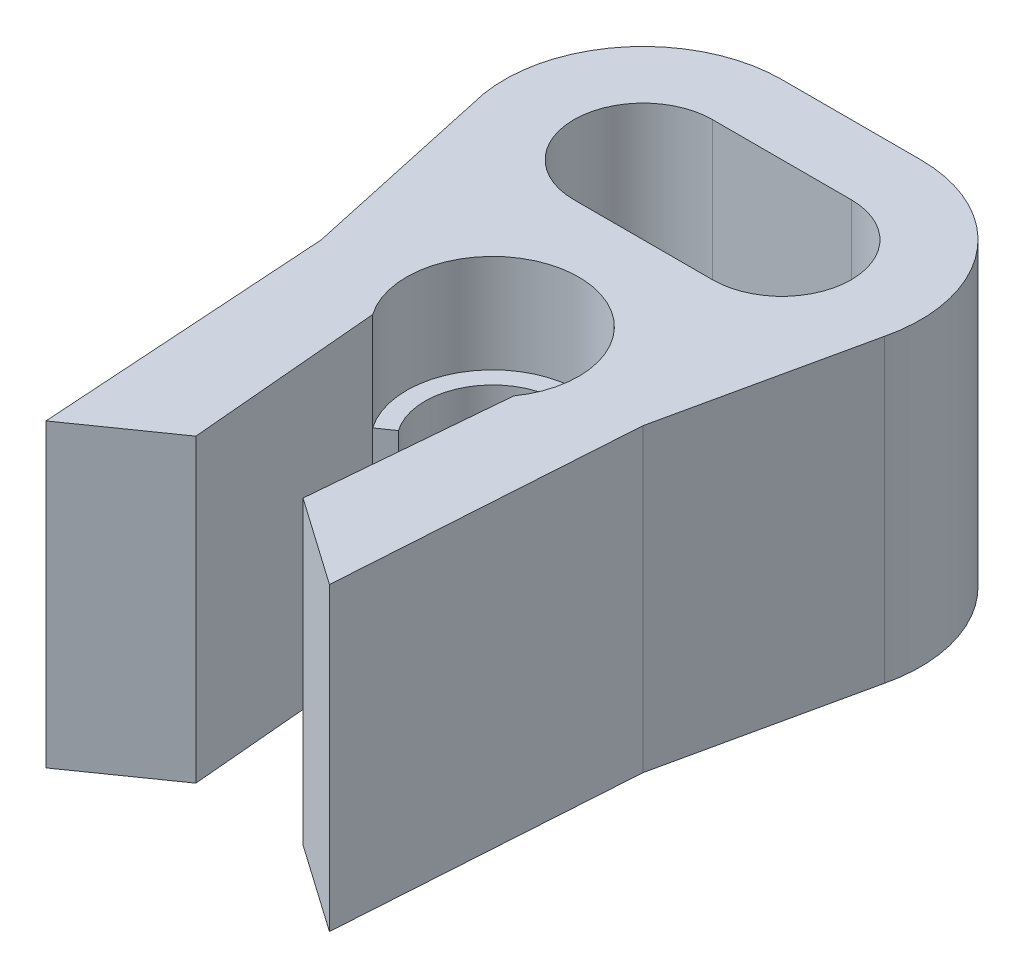
ISO-10303-21;
HEADER;
FILE_DESCRIPTION(('STEP AP214'),'2;1');
FILE_NAME('part.step','',(''),(''),'','','');
FILE_SCHEMA(('AUTOMOTIVE_DESIGN { 1 0 10303 214 1 1 1 1 }'));
ENDSEC;
DATA;
#1=APPLICATION_CONTEXT('core data for automotive mechanical design processes');
#2=APPLICATION_PROTOCOL_DEFINITION('international standard','automotive_design',2000,#1);
#3=PRODUCT_CONTEXT('',#1,'mechanical');
#4=PRODUCT('Part','Part','',(#3));
#5=PRODUCT_RELATED_PRODUCT_CATEGORY('part','',(#4));
#6=PRODUCT_DEFINITION_FORMATION('','',#4);
#7=PRODUCT_DEFINITION_CONTEXT('part definition',#1,'design');
#8=PRODUCT_DEFINITION('design','',#6,#7);
#9=PRODUCT_DEFINITION_SHAPE('','',#8);
#10=(LENGTH_UNIT() NAMED_UNIT(*) SI_UNIT(.MILLI.,.METRE.));
#11=(NAMED_UNIT(*) PLANE_ANGLE_UNIT() SI_UNIT($,.RADIAN.));
#12=(NAMED_UNIT(*) SI_UNIT($,.STERADIAN.) SOLID_ANGLE_UNIT());
#13=UNCERTAINTY_MEASURE_WITH_UNIT(LENGTH_MEASURE(1.E-05),#10,'distance_accuracy_value','');
#14=(GEOMETRIC_REPRESENTATION_CONTEXT(3) GLOBAL_UNCERTAINTY_ASSIGNED_CONTEXT((#13)) GLOBAL_UNIT_ASSIGNED_CONTEXT((#10,
#11,#12)) REPRESENTATION_CONTEXT('',''));
#15=CARTESIAN_POINT('',(0.,0.,0.));
#16=DIRECTION('',(0.,0.,1.));
#17=DIRECTION('',(1.,0.,0.));
#18=AXIS2_PLACEMENT_3D('',#15,#16,#17);
#19=CARTESIAN_POINT('',(0.,2.6,0.));
#20=DIRECTION('',(0.,-1.,0.));
#21=DIRECTION('',(0.,0.,-1.));
#22=AXIS2_PLACEMENT_3D('',#19,#20,#21);
#23=CYLINDRICAL_SURFACE('',#22,0.745);
#24=DIRECTION('',(0.,-1.,0.));
#25=VECTOR('',#24,1.);
#26=CARTESIAN_POINT('',(-0.6102682729953,2.6,0.427314445081528));
#27=LINE('',#26,#25);
#28=CARTESIAN_POINT('',(-0.6102682729953,2.6,0.427314445081528));
#29=VERTEX_POINT('',#28);
#30=CARTESIAN_POINT('',(-0.6102682729953,1.75,0.427314445081528));
#31=VERTEX_POINT('',#30);
#32=EDGE_CURVE('E253',#29,#31,#27,.T.);
#33=ORIENTED_EDGE('',*,*,#32,.T.);
#34=CARTESIAN_POINT('',(0.,1.75,0.));
#35=DIRECTION('',(0.,-1.,0.));
#36=DIRECTION('',(0.,0.,-1.));
#37=AXIS2_PLACEMENT_3D('',#34,#35,#36);
#38=CIRCLE('',#37,0.745);
#39=CARTESIAN_POINT('',(0.6102682729953,1.75,0.427314445081528));
#40=VERTEX_POINT('',#39);
#41=EDGE_CURVE('E378',#31,#40,#38,.T.);
#42=ORIENTED_EDGE('',*,*,#41,.T.);
#43=DIRECTION('',(0.,-1.,0.));
#44=VECTOR('',#43,1.);
#45=CARTESIAN_POINT('',(0.6102682729953,2.6,0.427314445081528));
#46=LINE('',#45,#44);
#47=CARTESIAN_POINT('',(0.6102682729953,2.6,0.427314445081528));
#48=VERTEX_POINT('',#47);
#49=EDGE_CURVE('E249',#48,#40,#46,.T.);
#50=ORIENTED_EDGE('',*,*,#49,.F.);
#51=CARTESIAN_POINT('',(0.,2.6,0.));
#52=DIRECTION('',(0.,1.,0.));
#53=DIRECTION('',(0.,0.,1.));
#54=AXIS2_PLACEMENT_3D('',#51,#52,#53);
#55=CIRCLE('',#54,0.745);
#56=EDGE_CURVE('E371',#48,#29,#55,.T.);
#57=ORIENTED_EDGE('',*,*,#56,.T.);
#58=EDGE_LOOP('',(#33,#42,#50,#57));
#59=FACE_BOUND('',#58,.T.);
#60=ADVANCED_FACE('F35',(#59),#23,.F.);
#61=CARTESIAN_POINT('',(0.,2.6,-3.10263632888684));
#62=DIRECTION('',(0.,0.,-1.));
#63=DIRECTION('',(-1.,0.,0.));
#64=AXIS2_PLACEMENT_3D('',#61,#62,#63);
#65=PLANE('',#64);
#66=DIRECTION('',(1.,0.,0.));
#67=VECTOR('',#66,1.);
#68=CARTESIAN_POINT('',(0.,0.,-3.10263632888684));
#69=LINE('',#68,#67);
#70=CARTESIAN_POINT('',(-0.600000000000004,0.,-3.10263632888684));
#71=VERTEX_POINT('',#70);
#72=CARTESIAN_POINT('',(0.6,0.,-3.10263632888684));
#73=VERTEX_POINT('',#72);
#74=EDGE_CURVE('E209',#71,#73,#69,.T.);
#75=ORIENTED_EDGE('',*,*,#74,.F.);
#76=DIRECTION('',(0.,-1.,0.));
#77=VECTOR('',#76,1.);
#78=CARTESIAN_POINT('',(-0.600000000000004,2.6,-3.10263632888684));
#79=LINE('',#78,#77);
#80=CARTESIAN_POINT('',(-0.600000000000004,2.6,-3.10263632888684));
#81=VERTEX_POINT('',#80);
#82=EDGE_CURVE('E11',#81,#71,#79,.T.);
#83=ORIENTED_EDGE('',*,*,#82,.F.);
#84=DIRECTION('',(1.,0.,0.));
#85=VECTOR('',#84,1.);
#86=CARTESIAN_POINT('',(0.,2.6,-3.10263632888684));
#87=LINE('',#86,#85);
#88=CARTESIAN_POINT('',(0.6,2.6,-3.10263632888684));
#89=VERTEX_POINT('',#88);
#90=EDGE_CURVE('E357',#81,#89,#87,.T.);
#91=ORIENTED_EDGE('',*,*,#90,.T.);
#92=DIRECTION('',(0.,-1.,0.));
#93=VECTOR('',#92,1.);
#94=CARTESIAN_POINT('',(0.6,2.6,-3.10263632888684));
#95=LINE('',#94,#93);
#96=EDGE_CURVE('E117',#89,#73,#95,.T.);
#97=ORIENTED_EDGE('',*,*,#96,.T.);
#98=EDGE_LOOP('',(#75,#83,#91,#97));
#99=FACE_BOUND('',#98,.T.);
#100=ADVANCED_FACE('F295',(#99),#65,.T.);
#101=CARTESIAN_POINT('',(-0.6,2.6,-1.90263632888684));
#102=DIRECTION('',(0.,-1.,0.));
#103=DIRECTION('',(0.,0.,-1.));
#104=AXIS2_PLACEMENT_3D('',#101,#102,#103);
#105=CYLINDRICAL_SURFACE('',#104,1.2);
#106=CARTESIAN_POINT('',(-0.6,0.,-1.90263632888684));
#107=DIRECTION('',(0.,1.,0.));
#108=DIRECTION('',(0.,0.,1.));
#109=AXIS2_PLACEMENT_3D('',#106,#107,#108);
#110=CIRCLE('',#109,1.2);
#111=CARTESIAN_POINT('',(-1.75911099154688,0.,-1.59205347476381));
#112=VERTEX_POINT('',#111);
#113=EDGE_CURVE('E212',#71,#112,#110,.T.);
#114=ORIENTED_EDGE('',*,*,#113,.T.);
#115=DIRECTION('',(0.,-1.,0.));
#116=VECTOR('',#115,1.);
#117=CARTESIAN_POINT('',(-1.75911099154688,2.6,-1.59205347476381));
#118=LINE('',#117,#116);
#119=CARTESIAN_POINT('',(-1.75911099154688,2.6,-1.59205347476381));
#120=VERTEX_POINT('',#119);
#121=EDGE_CURVE('E44',#120,#112,#118,.T.);
#122=ORIENTED_EDGE('',*,*,#121,.F.);
#123=CARTESIAN_POINT('',(-0.6,2.6,-1.90263632888684));
#124=DIRECTION('',(0.,1.,0.));
#125=DIRECTION('',(0.,0.,1.));
#126=AXIS2_PLACEMENT_3D('',#123,#124,#125);
#127=CIRCLE('',#126,1.2);
#128=EDGE_CURVE('E359',#81,#120,#127,.T.);
#129=ORIENTED_EDGE('',*,*,#128,.F.);
#130=ORIENTED_EDGE('',*,*,#82,.T.);
#131=EDGE_LOOP('',(#114,#122,#129,#130));
#132=FACE_BOUND('',#131,.T.);
#133=ADVANCED_FACE('F302',(#132),#105,.T.);
#134=CARTESIAN_POINT('',(-1.34770206517666,2.6,0.293980247149908));
#135=DIRECTION('',(-0.977025399259786,0.,0.213122896942715));
#136=DIRECTION('',(0.213122896942715,0.,0.977025399259786));
#137=AXIS2_PLACEMENT_3D('',#134,#135,#136);
#138=PLANE('',#137);
#139=DIRECTION('',(-0.213122896942715,0.,-0.977025399259787));
#140=VECTOR('',#139,1.);
#141=CARTESIAN_POINT('',(-1.34770206517666,0.,0.293980247149908));
#142=LINE('',#141,#140);
#143=CARTESIAN_POINT('',(-1.39204994320427,0.,0.0906750000000002));
#144=VERTEX_POINT('',#143);
#145=EDGE_CURVE('E215',#144,#112,#142,.T.);
#146=ORIENTED_EDGE('',*,*,#145,.F.);
#147=DIRECTION('',(0.,-1.,0.));
#148=VECTOR('',#147,1.);
#149=CARTESIAN_POINT('',(-1.39204994320427,2.6,0.0906750000000002));
#150=LINE('',#149,#148);
#151=CARTESIAN_POINT('',(-1.39204994320427,2.6,0.0906750000000002));
#152=VERTEX_POINT('',#151);
#153=EDGE_CURVE('E260',#152,#144,#150,.T.);
#154=ORIENTED_EDGE('',*,*,#153,.F.);
#155=DIRECTION('',(-0.213122896942715,0.,-0.977025399259787));
#156=VECTOR('',#155,1.);
#157=CARTESIAN_POINT('',(-1.34770206517666,2.6,0.293980247149908));
#158=LINE('',#157,#156);
#159=EDGE_CURVE('E361',#152,#120,#158,.T.);
#160=ORIENTED_EDGE('',*,*,#159,.T.);
#161=ORIENTED_EDGE('',*,*,#121,.T.);
#162=EDGE_LOOP('',(#146,#154,#160,#161));
#163=FACE_BOUND('',#162,.T.);
#164=ADVANCED_FACE('F447',(#163),#138,.T.);
#165=CARTESIAN_POINT('',(-1.39204994320427,2.6,0.0906750000000001));
#166=DIRECTION('',(0.99788526394571,0.,-0.0650000000000001));
#167=DIRECTION('',(-0.0650000000000001,0.,-0.99788526394571));
#168=AXIS2_PLACEMENT_3D('',#165,#166,#167);
#169=PLANE('',#168);
#170=DIRECTION('',(0.065,0.,0.99788526394571));
#171=VECTOR('',#170,1.);
#172=CARTESIAN_POINT('',(-1.39204994320427,0.,0.0906750000000001));
#173=LINE('',#172,#171);
#174=CARTESIAN_POINT('',(-1.22613750826478,0.,2.63777613740721));
#175=VERTEX_POINT('',#174);
#176=EDGE_CURVE('E218',#144,#175,#173,.T.);
#177=ORIENTED_EDGE('',*,*,#176,.T.);
#178=DIRECTION('',(0.,-1.,0.));
#179=VECTOR('',#178,1.);
#180=CARTESIAN_POINT('',(-1.22613750826478,2.6,2.63777613740721));
#181=LINE('',#180,#179);
#182=CARTESIAN_POINT('',(-1.22613750826478,2.6,2.63777613740721));
#183=VERTEX_POINT('',#182);
#184=EDGE_CURVE('E258',#183,#175,#181,.T.);
#185=ORIENTED_EDGE('',*,*,#184,.F.);
#186=DIRECTION('',(0.065,0.,0.99788526394571));
#187=VECTOR('',#186,1.);
#188=CARTESIAN_POINT('',(-1.39204994320427,2.6,0.0906750000000001));
#189=LINE('',#188,#187);
#190=EDGE_CURVE('E364',#152,#183,#189,.T.);
#191=ORIENTED_EDGE('',*,*,#190,.F.);
#192=ORIENTED_EDGE('',*,*,#153,.T.);
#193=EDGE_LOOP('',(#177,#185,#191,#192));
#194=FACE_BOUND('',#193,.T.);
#195=ADVANCED_FACE('F452',(#194),#169,.F.);
#196=CARTESIAN_POINT('',(0.835962494827816,2.6,1.19387817069952));
#197=DIRECTION('',(0.573576436351044,0.,0.819152044288993));
#198=DIRECTION('',(0.819152044288993,0.,-0.573576436351044));
#199=AXIS2_PLACEMENT_3D('',#196,#197,#198);
#200=PLANE('',#199);
#201=DIRECTION('',(-0.819152044288993,0.,0.573576436351044));
#202=VECTOR('',#201,1.);
#203=CARTESIAN_POINT('',(0.835962494827816,0.,1.19387817069952));
#204=LINE('',#203,#202);
#205=CARTESIAN_POINT('',(-0.463591661400463,0.,2.10383578720231));
#206=VERTEX_POINT('',#205);
#207=EDGE_CURVE('E221',#206,#175,#204,.T.);
#208=ORIENTED_EDGE('',*,*,#207,.F.);
#209=DIRECTION('',(0.,-1.,0.));
#210=VECTOR('',#209,1.);
#211=CARTESIAN_POINT('',(-0.463591661400463,2.6,2.10383578720231));
#212=LINE('',#211,#210);
#213=CARTESIAN_POINT('',(-0.463591661400463,2.6,2.10383578720231));
#214=VERTEX_POINT('',#213);
#215=EDGE_CURVE('E256',#214,#206,#212,.T.);
#216=ORIENTED_EDGE('',*,*,#215,.F.);
#217=DIRECTION('',(-0.819152044288993,0.,0.573576436351044));
#218=VECTOR('',#217,1.);
#219=CARTESIAN_POINT('',(0.835962494827816,2.6,1.19387817069952));
#220=LINE('',#219,#218);
#221=EDGE_CURVE('E366',#214,#183,#220,.T.);
#222=ORIENTED_EDGE('',*,*,#221,.T.);
#223=ORIENTED_EDGE('',*,*,#184,.T.);
#224=EDGE_LOOP('',(#208,#216,#222,#223));
#225=FACE_BOUND('',#224,.T.);
#226=ADVANCED_FACE('F316',(#225),#200,.T.);
#227=CARTESIAN_POINT('',(-0.642733787168803,2.6,0.0562319200423545));
#228=DIRECTION('',(0.996194698091746,0.,-0.0871557427476585));
#229=DIRECTION('',(-0.0871557427476585,0.,-0.996194698091746));
#230=AXIS2_PLACEMENT_3D('',#227,#228,#229);
#231=PLANE('',#230);
#232=DIRECTION('',(0.0871557427476586,0.,0.996194698091746));
#233=VECTOR('',#232,1.);
#234=CARTESIAN_POINT('',(-0.642733787168803,0.,0.0562319200423545));
#235=LINE('',#234,#233);
#236=CARTESIAN_POINT('',(-0.6102682729953,0.,0.427314445081528));
#237=VERTEX_POINT('',#236);
#238=EDGE_CURVE('E224',#237,#206,#235,.T.);
#239=ORIENTED_EDGE('',*,*,#238,.F.);
#240=CARTESIAN_POINT('',(-0.6102682729953,0.85,0.427314445081528));
#241=VERTEX_POINT('',#240);
#242=EDGE_CURVE('E252',#241,#237,#27,.T.);
#243=ORIENTED_EDGE('',*,*,#242,.F.);
#244=DIRECTION('',(0.,-1.,0.));
#245=VECTOR('',#244,1.);
#246=CARTESIAN_POINT('',(-0.6102682729953,1.75,0.427314445081528));
#247=LINE('',#246,#245);
#248=EDGE_CURVE('E335',#31,#241,#247,.T.);
#249=ORIENTED_EDGE('',*,*,#248,.F.);
#250=ORIENTED_EDGE('',*,*,#32,.F.);
#251=DIRECTION('',(0.0871557427476586,0.,0.996194698091746));
#252=VECTOR('',#251,1.);
#253=CARTESIAN_POINT('',(-0.642733787168803,2.6,0.0562319200423545));
#254=LINE('',#253,#252);
#255=EDGE_CURVE('E369',#29,#214,#254,.T.);
#256=ORIENTED_EDGE('',*,*,#255,.T.);
#257=ORIENTED_EDGE('',*,*,#215,.T.);
#258=EDGE_LOOP('',(#239,#243,#249,#250,#256,#257));
#259=FACE_BOUND('',#258,.T.);
#260=ADVANCED_FACE('F308',(#259),#231,.T.);
#261=CARTESIAN_POINT('',(0.,0.85,0.));
#262=DIRECTION('',(0.,-1.,0.));
#263=DIRECTION('',(0.,0.,-1.));
#264=AXIS2_PLACEMENT_3D('',#261,#262,#263);
#265=CIRCLE('',#264,0.745);
#266=CARTESIAN_POINT('',(0.6102682729953,0.85,0.427314445081528));
#267=VERTEX_POINT('',#266);
#268=EDGE_CURVE('E321',#241,#267,#265,.T.);
#269=ORIENTED_EDGE('',*,*,#268,.F.);
#270=ORIENTED_EDGE('',*,*,#242,.T.);
#271=CARTESIAN_POINT('',(0.,0.,0.));
#272=DIRECTION('',(0.,1.,0.));
#273=DIRECTION('',(0.,0.,1.));
#274=AXIS2_PLACEMENT_3D('',#271,#272,#273);
#275=CIRCLE('',#274,0.745);
#276=CARTESIAN_POINT('',(0.6102682729953,0.,0.427314445081528));
#277=VERTEX_POINT('',#276);
#278=EDGE_CURVE('E227',#277,#237,#275,.T.);
#279=ORIENTED_EDGE('',*,*,#278,.F.);
#280=EDGE_CURVE('E248',#267,#277,#46,.T.);
#281=ORIENTED_EDGE('',*,*,#280,.F.);
#282=EDGE_LOOP('',(#269,#270,#279,#281));
#283=FACE_BOUND('',#282,.T.);
#284=ADVANCED_FACE('F298',(#283),#23,.F.);
#285=CARTESIAN_POINT('',(0.642733787168803,2.6,0.0562319200423545));
#286=DIRECTION('',(0.996194698091746,0.,0.0871557427476585));
#287=DIRECTION('',(0.0871557427476585,0.,-0.996194698091746));
#288=AXIS2_PLACEMENT_3D('',#285,#286,#287);
#289=PLANE('',#288);
#290=DIRECTION('',(-0.0871557427476586,0.,0.996194698091746));
#291=VECTOR('',#290,1.);
#292=CARTESIAN_POINT('',(0.642733787168803,0.,0.0562319200423545));
#293=LINE('',#292,#291);
#294=CARTESIAN_POINT('',(0.463591661400463,0.,2.10383578720231));
#295=VERTEX_POINT('',#294);
#296=EDGE_CURVE('E230',#277,#295,#293,.T.);
#297=ORIENTED_EDGE('',*,*,#296,.T.);
#298=DIRECTION('',(0.,-1.,0.));
#299=VECTOR('',#298,1.);
#300=CARTESIAN_POINT('',(0.463591661400463,2.6,2.10383578720231));
#301=LINE('',#300,#299);
#302=CARTESIAN_POINT('',(0.463591661400463,2.6,2.10383578720231));
#303=VERTEX_POINT('',#302);
#304=EDGE_CURVE('E245',#303,#295,#301,.T.);
#305=ORIENTED_EDGE('',*,*,#304,.F.);
#306=DIRECTION('',(-0.0871557427476586,0.,0.996194698091746));
#307=VECTOR('',#306,1.);
#308=CARTESIAN_POINT('',(0.642733787168803,2.6,0.0562319200423545));
#309=LINE('',#308,#307);
#310=EDGE_CURVE('E190',#48,#303,#309,.T.);
#311=ORIENTED_EDGE('',*,*,#310,.F.);
#312=ORIENTED_EDGE('',*,*,#49,.T.);
#313=DIRECTION('',(0.,-1.,0.));
#314=VECTOR('',#313,1.);
#315=CARTESIAN_POINT('',(0.6102682729953,1.75,0.427314445081528));
#316=LINE('',#315,#314);
#317=EDGE_CURVE('E341',#40,#267,#316,.T.);
#318=ORIENTED_EDGE('',*,*,#317,.T.);
#319=ORIENTED_EDGE('',*,*,#280,.T.);
#320=EDGE_LOOP('',(#297,#305,#311,#312,#318,#319));
#321=FACE_BOUND('',#320,.T.);
#322=ADVANCED_FACE('F307',(#321),#289,.F.);
#323=CARTESIAN_POINT('',(-0.835962494827816,2.6,1.19387817069952));
#324=DIRECTION('',(0.573576436351044,0.,-0.819152044288993));
#325=DIRECTION('',(-0.819152044288993,0.,-0.573576436351044));
#326=AXIS2_PLACEMENT_3D('',#323,#324,#325);
#327=PLANE('',#326);
#328=DIRECTION('',(0.819152044288993,0.,0.573576436351044));
#329=VECTOR('',#328,1.);
#330=CARTESIAN_POINT('',(-0.835962494827816,0.,1.19387817069952));
#331=LINE('',#330,#329);
#332=CARTESIAN_POINT('',(1.22613750826478,0.,2.63777613740721));
#333=VERTEX_POINT('',#332);
#334=EDGE_CURVE('E233',#295,#333,#331,.T.);
#335=ORIENTED_EDGE('',*,*,#334,.T.);
#336=DIRECTION('',(0.,-1.,0.));
#337=VECTOR('',#336,1.);
#338=CARTESIAN_POINT('',(1.22613750826478,2.6,2.63777613740721));
#339=LINE('',#338,#337);
#340=CARTESIAN_POINT('',(1.22613750826478,2.6,2.63777613740721));
#341=VERTEX_POINT('',#340);
#342=EDGE_CURVE('E177',#341,#333,#339,.T.);
#343=ORIENTED_EDGE('',*,*,#342,.F.);
#344=DIRECTION('',(0.819152044288993,0.,0.573576436351044));
#345=VECTOR('',#344,1.);
#346=CARTESIAN_POINT('',(-0.835962494827816,2.6,1.19387817069952));
#347=LINE('',#346,#345);
#348=EDGE_CURVE('E187',#303,#341,#347,.T.);
#349=ORIENTED_EDGE('',*,*,#348,.F.);
#350=ORIENTED_EDGE('',*,*,#304,.T.);
#351=EDGE_LOOP('',(#335,#343,#349,#350));
#352=FACE_BOUND('',#351,.T.);
#353=ADVANCED_FACE('F314',(#352),#327,.F.);
#354=CARTESIAN_POINT('',(1.39204994320427,2.6,0.0906750000000001));
#355=DIRECTION('',(0.99788526394571,0.,0.0650000000000001));
#356=DIRECTION('',(0.0650000000000001,0.,-0.99788526394571));
#357=AXIS2_PLACEMENT_3D('',#354,#355,#356);
#358=PLANE('',#357);
#359=DIRECTION('',(-0.065,0.,0.99788526394571));
#360=VECTOR('',#359,1.);
#361=CARTESIAN_POINT('',(1.39204994320427,0.,0.0906750000000001));
#362=LINE('',#361,#360);
#363=CARTESIAN_POINT('',(1.39204994320427,0.,0.0906750000000002));
#364=VERTEX_POINT('',#363);
#365=EDGE_CURVE('E173',#364,#333,#362,.T.);
#366=ORIENTED_EDGE('',*,*,#365,.F.);
#367=DIRECTION('',(0.,-1.,0.));
#368=VECTOR('',#367,1.);
#369=CARTESIAN_POINT('',(1.39204994320427,2.6,0.0906750000000002));
#370=LINE('',#369,#368);
#371=CARTESIAN_POINT('',(1.39204994320427,2.6,0.0906750000000002));
#372=VERTEX_POINT('',#371);
#373=EDGE_CURVE('E167',#372,#364,#370,.T.);
#374=ORIENTED_EDGE('',*,*,#373,.F.);
#375=DIRECTION('',(-0.065,0.,0.99788526394571));
#376=VECTOR('',#375,1.);
#377=CARTESIAN_POINT('',(1.39204994320427,2.6,0.0906750000000001));
#378=LINE('',#377,#376);
#379=EDGE_CURVE('E171',#372,#341,#378,.T.);
#380=ORIENTED_EDGE('',*,*,#379,.T.);
#381=ORIENTED_EDGE('',*,*,#342,.T.);
#382=EDGE_LOOP('',(#366,#374,#380,#381));
#383=FACE_BOUND('',#382,.T.);
#384=ADVANCED_FACE('F169',(#383),#358,.T.);
#385=CARTESIAN_POINT('',(1.34739788857477,2.6,0.294776015539525));
#386=DIRECTION('',(-0.976895063635303,0.,-0.213719523312632));
#387=DIRECTION('',(-0.213719523312632,0.,0.976895063635302));
#388=AXIS2_PLACEMENT_3D('',#385,#386,#387);
#389=PLANE('',#388);
#390=DIRECTION('',(0.213719523312632,0.,-0.976895063635303));
#391=VECTOR('',#390,1.);
#392=CARTESIAN_POINT('',(1.34739788857477,0.,0.294776015539525));
#393=LINE('',#392,#391);
#394=CARTESIAN_POINT('',(1.76690159835493,0.,-1.62274231366552));
#395=VERTEX_POINT('',#394);
#396=EDGE_CURVE('E237',#364,#395,#393,.T.);
#397=ORIENTED_EDGE('',*,*,#396,.T.);
#398=DIRECTION('',(0.,-1.,0.));
#399=VECTOR('',#398,1.);
#400=CARTESIAN_POINT('',(1.76690159835493,2.6,-1.62274231366552));
#401=LINE('',#400,#399);
#402=CARTESIAN_POINT('',(1.76690159835493,2.6,-1.62274231366552));
#403=VERTEX_POINT('',#402);
#404=EDGE_CURVE('E178',#403,#395,#401,.T.);
#405=ORIENTED_EDGE('',*,*,#404,.F.);
#406=DIRECTION('',(0.213719523312632,0.,-0.976895063635303));
#407=VECTOR('',#406,1.);
#408=CARTESIAN_POINT('',(1.34739788857477,2.6,0.294776015539525));
#409=LINE('',#408,#407);
#410=EDGE_CURVE('E181',#372,#403,#409,.T.);
#411=ORIENTED_EDGE('',*,*,#410,.F.);
#412=ORIENTED_EDGE('',*,*,#373,.T.);
#413=EDGE_LOOP('',(#397,#405,#411,#412));
#414=FACE_BOUND('',#413,.T.);
#415=ADVANCED_FACE('F182',(#414),#389,.F.);
#416=CARTESIAN_POINT('',(0.6,2.6,-1.90263632888684));
#417=DIRECTION('',(0.,-1.,0.));
#418=DIRECTION('',(0.,0.,-1.));
#419=AXIS2_PLACEMENT_3D('',#416,#417,#418);
#420=CYLINDRICAL_SURFACE('',#419,0.6);
#421=CARTESIAN_POINT('',(0.6,0.,-1.90263632888684));
#422=DIRECTION('',(0.,1.,0.));
#423=DIRECTION('',(0.,0.,1.));
#424=AXIS2_PLACEMENT_3D('',#421,#422,#423);
#425=CIRCLE('',#424,0.6);
#426=CARTESIAN_POINT('',(0.6,0.,-1.30263632888684));
#427=VERTEX_POINT('',#426);
#428=CARTESIAN_POINT('',(0.6,0.,-2.50263632888684));
#429=VERTEX_POINT('',#428);
#430=EDGE_CURVE('E196',#427,#429,#425,.T.);
#431=ORIENTED_EDGE('',*,*,#430,.F.);
#432=DIRECTION('',(0.,-1.,0.));
#433=VECTOR('',#432,1.);
#434=CARTESIAN_POINT('',(0.6,2.6,-1.30263632888684));
#435=LINE('',#434,#433);
#436=CARTESIAN_POINT('',(0.6,2.6,-1.30263632888684));
#437=VERTEX_POINT('',#436);
#438=EDGE_CURVE('E39',#437,#427,#435,.T.);
#439=ORIENTED_EDGE('',*,*,#438,.F.);
#440=CARTESIAN_POINT('',(0.6,2.6,-1.90263632888684));
#441=DIRECTION('',(0.,1.,0.));
#442=DIRECTION('',(0.,0.,1.));
#443=AXIS2_PLACEMENT_3D('',#440,#441,#442);
#444=CIRCLE('',#443,0.6);
#445=CARTESIAN_POINT('',(0.6,2.6,-2.50263632888684));
#446=VERTEX_POINT('',#445);
#447=EDGE_CURVE('E241',#437,#446,#444,.T.);
#448=ORIENTED_EDGE('',*,*,#447,.T.);
#449=DIRECTION('',(0.,-1.,0.));
#450=VECTOR('',#449,1.);
#451=CARTESIAN_POINT('',(0.6,2.6,-2.50263632888684));
#452=LINE('',#451,#450);
#453=EDGE_CURVE('E195',#446,#429,#452,.T.);
#454=ORIENTED_EDGE('',*,*,#453,.T.);
#455=EDGE_LOOP('',(#431,#439,#448,#454));
#456=FACE_BOUND('',#455,.T.);
#457=ADVANCED_FACE('F37',(#456),#420,.F.);
#458=CARTESIAN_POINT('',(0.,2.6,-1.30263632888684));
#459=DIRECTION('',(0.,0.,1.));
#460=DIRECTION('',(1.,0.,0.));
#461=AXIS2_PLACEMENT_3D('',#458,#459,#460);
#462=PLANE('',#461);
#463=DIRECTION('',(-1.,0.,0.));
#464=VECTOR('',#463,1.);
#465=CARTESIAN_POINT('',(0.,0.,-1.30263632888684));
#466=LINE('',#465,#464);
#467=CARTESIAN_POINT('',(-0.6,0.,-1.30263632888684));
#468=VERTEX_POINT('',#467);
#469=EDGE_CURVE('E199',#427,#468,#466,.T.);
#470=ORIENTED_EDGE('',*,*,#469,.T.);
#471=DIRECTION('',(0.,-1.,0.));
#472=VECTOR('',#471,1.);
#473=CARTESIAN_POINT('',(-0.6,2.6,-1.30263632888684));
#474=LINE('',#473,#472);
#475=CARTESIAN_POINT('',(-0.6,2.6,-1.30263632888684));
#476=VERTEX_POINT('',#475);
#477=EDGE_CURVE('E265',#476,#468,#474,.T.);
#478=ORIENTED_EDGE('',*,*,#477,.F.);
#479=DIRECTION('',(-1.,0.,0.));
#480=VECTOR('',#479,1.);
#481=CARTESIAN_POINT('',(0.,2.6,-1.30263632888684));
#482=LINE('',#481,#480);
#483=EDGE_CURVE('E273',#437,#476,#482,.T.);
#484=ORIENTED_EDGE('',*,*,#483,.F.);
#485=ORIENTED_EDGE('',*,*,#438,.T.);
#486=EDGE_LOOP('',(#470,#478,#484,#485));
#487=FACE_BOUND('',#486,.T.);
#488=ADVANCED_FACE('F272',(#487),#462,.F.);
#489=CARTESIAN_POINT('',(-0.6,2.6,-1.90263632888684));
#490=DIRECTION('',(0.,-1.,0.));
#491=DIRECTION('',(0.,0.,-1.));
#492=AXIS2_PLACEMENT_3D('',#489,#490,#491);
#493=CYLINDRICAL_SURFACE('',#492,0.6);
#494=CARTESIAN_POINT('',(-0.6,0.,-1.90263632888684));
#495=DIRECTION('',(0.,1.,0.));
#496=DIRECTION('',(0.,0.,1.));
#497=AXIS2_PLACEMENT_3D('',#494,#495,#496);
#498=CIRCLE('',#497,0.6);
#499=CARTESIAN_POINT('',(-0.6,0.,-2.50263632888684));
#500=VERTEX_POINT('',#499);
#501=EDGE_CURVE('E203',#500,#468,#498,.T.);
#502=ORIENTED_EDGE('',*,*,#501,.F.);
#503=DIRECTION('',(0.,-1.,0.));
#504=VECTOR('',#503,1.);
#505=CARTESIAN_POINT('',(-0.6,2.6,-2.50263632888684));
#506=LINE('',#505,#504);
#507=CARTESIAN_POINT('',(-0.6,2.6,-2.50263632888684));
#508=VERTEX_POINT('',#507);
#509=EDGE_CURVE('E264',#508,#500,#506,.T.);
#510=ORIENTED_EDGE('',*,*,#509,.F.);
#511=CARTESIAN_POINT('',(-0.6,2.6,-1.90263632888684));
#512=DIRECTION('',(0.,1.,0.));
#513=DIRECTION('',(0.,0.,1.));
#514=AXIS2_PLACEMENT_3D('',#511,#512,#513);
#515=CIRCLE('',#514,0.6);
#516=EDGE_CURVE('E354',#508,#476,#515,.T.);
#517=ORIENTED_EDGE('',*,*,#516,.T.);
#518=ORIENTED_EDGE('',*,*,#477,.T.);
#519=EDGE_LOOP('',(#502,#510,#517,#518));
#520=FACE_BOUND('',#519,.T.);
#521=ADVANCED_FACE('F285',(#520),#493,.F.);
#522=CARTESIAN_POINT('',(0.,2.6,-2.50263632888684));
#523=DIRECTION('',(0.,0.,1.));
#524=DIRECTION('',(1.,0.,0.));
#525=AXIS2_PLACEMENT_3D('',#522,#523,#524);
#526=PLANE('',#525);
#527=DIRECTION('',(-1.,0.,0.));
#528=VECTOR('',#527,1.);
#529=CARTESIAN_POINT('',(0.,0.,-2.50263632888684));
#530=LINE('',#529,#528);
#531=EDGE_CURVE('E206',#429,#500,#530,.T.);
#532=ORIENTED_EDGE('',*,*,#531,.F.);
#533=ORIENTED_EDGE('',*,*,#453,.F.);
#534=DIRECTION('',(-1.,0.,0.));
#535=VECTOR('',#534,1.);
#536=CARTESIAN_POINT('',(0.,2.6,-2.50263632888684));
#537=LINE('',#536,#535);
#538=EDGE_CURVE('E283',#446,#508,#537,.T.);
#539=ORIENTED_EDGE('',*,*,#538,.T.);
#540=ORIENTED_EDGE('',*,*,#509,.T.);
#541=EDGE_LOOP('',(#532,#533,#539,#540));
#542=FACE_BOUND('',#541,.T.);
#543=ADVANCED_FACE('F282',(#542),#526,.T.);
#544=CARTESIAN_POINT('',(0.6,2.6,-1.90263632888684));
#545=DIRECTION('',(0.,-1.,0.));
#546=DIRECTION('',(0.,0.,-1.));
#547=AXIS2_PLACEMENT_3D('',#544,#545,#546);
#548=CYLINDRICAL_SURFACE('',#547,1.2);
#549=CARTESIAN_POINT('',(0.6,0.,-1.90263632888684));
#550=DIRECTION('',(0.,1.,0.));
#551=DIRECTION('',(0.,0.,1.));
#552=AXIS2_PLACEMENT_3D('',#549,#550,#551);
#553=CIRCLE('',#552,1.2);
#554=EDGE_CURVE('E239',#395,#73,#553,.T.);
#555=ORIENTED_EDGE('',*,*,#554,.T.);
#556=ORIENTED_EDGE('',*,*,#96,.F.);
#557=CARTESIAN_POINT('',(0.6,2.6,-1.90263632888684));
#558=DIRECTION('',(0.,1.,0.));
#559=DIRECTION('',(0.,0.,1.));
#560=AXIS2_PLACEMENT_3D('',#557,#558,#559);
#561=CIRCLE('',#560,1.2);
#562=EDGE_CURVE('E61',#403,#89,#561,.T.);
#563=ORIENTED_EDGE('',*,*,#562,.F.);
#564=ORIENTED_EDGE('',*,*,#404,.T.);
#565=EDGE_LOOP('',(#555,#556,#563,#564));
#566=FACE_BOUND('',#565,.T.);
#567=ADVANCED_FACE('F292',(#566),#548,.T.);
#568=CARTESIAN_POINT('',(0.,2.6,0.));
#569=DIRECTION('',(0.,1.,0.));
#570=DIRECTION('',(0.,0.,1.));
#571=AXIS2_PLACEMENT_3D('',#568,#569,#570);
#572=PLANE('',#571);
#573=ORIENTED_EDGE('',*,*,#447,.F.);
#574=ORIENTED_EDGE('',*,*,#483,.T.);
#575=ORIENTED_EDGE('',*,*,#516,.F.);
#576=ORIENTED_EDGE('',*,*,#538,.F.);
#577=EDGE_LOOP('',(#573,#574,#575,#576));
#578=FACE_BOUND('',#577,.T.);
#579=ORIENTED_EDGE('',*,*,#90,.F.);
#580=ORIENTED_EDGE('',*,*,#128,.T.);
#581=ORIENTED_EDGE('',*,*,#159,.F.);
#582=ORIENTED_EDGE('',*,*,#190,.T.);
#583=ORIENTED_EDGE('',*,*,#221,.F.);
#584=ORIENTED_EDGE('',*,*,#255,.F.);
#585=ORIENTED_EDGE('',*,*,#56,.F.);
#586=ORIENTED_EDGE('',*,*,#310,.T.);
#587=ORIENTED_EDGE('',*,*,#348,.T.);
#588=ORIENTED_EDGE('',*,*,#379,.F.);
#589=ORIENTED_EDGE('',*,*,#410,.T.);
#590=ORIENTED_EDGE('',*,*,#562,.T.);
#591=EDGE_LOOP('',(#579,#580,#581,#582,#583,#584,#585,#586,#587,#588,#589,#590));
#592=FACE_BOUND('',#591,.T.);
#593=ADVANCED_FACE('F185',(#578,#592),#572,.T.);
#594=CARTESIAN_POINT('',(0.,0.,0.));
#595=DIRECTION('',(0.,1.,0.));
#596=DIRECTION('',(0.,0.,1.));
#597=AXIS2_PLACEMENT_3D('',#594,#595,#596);
#598=PLANE('',#597);
#599=ORIENTED_EDGE('',*,*,#430,.T.);
#600=ORIENTED_EDGE('',*,*,#531,.T.);
#601=ORIENTED_EDGE('',*,*,#501,.T.);
#602=ORIENTED_EDGE('',*,*,#469,.F.);
#603=EDGE_LOOP('',(#599,#600,#601,#602));
#604=FACE_BOUND('',#603,.T.);
#605=ORIENTED_EDGE('',*,*,#74,.T.);
#606=ORIENTED_EDGE('',*,*,#554,.F.);
#607=ORIENTED_EDGE('',*,*,#396,.F.);
#608=ORIENTED_EDGE('',*,*,#365,.T.);
#609=ORIENTED_EDGE('',*,*,#334,.F.);
#610=ORIENTED_EDGE('',*,*,#296,.F.);
#611=ORIENTED_EDGE('',*,*,#278,.T.);
#612=ORIENTED_EDGE('',*,*,#238,.T.);
#613=ORIENTED_EDGE('',*,*,#207,.T.);
#614=ORIENTED_EDGE('',*,*,#176,.F.);
#615=ORIENTED_EDGE('',*,*,#145,.T.);
#616=ORIENTED_EDGE('',*,*,#113,.F.);
#617=EDGE_LOOP('',(#605,#606,#607,#608,#609,#610,#611,#612,#613,#614,#615,#616));
#618=FACE_BOUND('',#617,.T.);
#619=ADVANCED_FACE('F276',(#604,#618),#598,.F.);
#620=CARTESIAN_POINT('',(0.,1.75,0.));
#621=DIRECTION('',(0.573576436351044,0.,0.819152044288993));
#622=DIRECTION('',(0.819152044288993,0.,-0.573576436351044));
#623=AXIS2_PLACEMENT_3D('',#620,#621,#622);
#624=PLANE('',#623);
#625=ORIENTED_EDGE('',*,*,#248,.T.);
#626=DIRECTION('',(-0.819152044288993,0.,0.573576436351044));
#627=VECTOR('',#626,1.);
#628=CARTESIAN_POINT('',(0.,0.85,0.));
#629=LINE('',#628,#627);
#630=CARTESIAN_POINT('',(-0.479203945909061,0.85,0.335542215265361));
#631=VERTEX_POINT('',#630);
#632=EDGE_CURVE('E331',#631,#241,#629,.T.);
#633=ORIENTED_EDGE('',*,*,#632,.F.);
#634=DIRECTION('',(0.,-1.,0.));
#635=VECTOR('',#634,1.);
#636=CARTESIAN_POINT('',(-0.479203945909061,1.75,0.335542215265361));
#637=LINE('',#636,#635);
#638=CARTESIAN_POINT('',(-0.479203945909061,1.75,0.335542215265361));
#639=VERTEX_POINT('',#638);
#640=EDGE_CURVE('E200',#639,#631,#637,.T.);
#641=ORIENTED_EDGE('',*,*,#640,.F.);
#642=DIRECTION('',(-0.819152044288993,0.,0.573576436351044));
#643=VECTOR('',#642,1.);
#644=CARTESIAN_POINT('',(0.,1.75,0.));
#645=LINE('',#644,#643);
#646=EDGE_CURVE('E385',#639,#31,#645,.T.);
#647=ORIENTED_EDGE('',*,*,#646,.T.);
#648=EDGE_LOOP('',(#625,#633,#641,#647));
#649=FACE_BOUND('',#648,.T.);
#650=ADVANCED_FACE('F405',(#649),#624,.T.);
#651=CARTESIAN_POINT('',(0.,1.75,0.));
#652=DIRECTION('',(0.,-1.,0.));
#653=DIRECTION('',(0.,0.,-1.));
#654=AXIS2_PLACEMENT_3D('',#651,#652,#653);
#655=CYLINDRICAL_SURFACE('',#654,0.585);
#656=ORIENTED_EDGE('',*,*,#640,.T.);
#657=CARTESIAN_POINT('',(0.,0.85,0.));
#658=DIRECTION('',(0.,-1.,0.));
#659=DIRECTION('',(0.,0.,-1.));
#660=AXIS2_PLACEMENT_3D('',#657,#658,#659);
#661=CIRCLE('',#660,0.585);
#662=CARTESIAN_POINT('',(0.479203945909061,0.85,0.335542215265361));
#663=VERTEX_POINT('',#662);
#664=EDGE_CURVE('E388',#631,#663,#661,.T.);
#665=ORIENTED_EDGE('',*,*,#664,.T.);
#666=DIRECTION('',(0.,-1.,0.));
#667=VECTOR('',#666,1.);
#668=CARTESIAN_POINT('',(0.479203945909061,1.75,0.335542215265361));
#669=LINE('',#668,#667);
#670=CARTESIAN_POINT('',(0.479203945909061,1.75,0.335542215265361));
#671=VERTEX_POINT('',#670);
#672=EDGE_CURVE('E345',#671,#663,#669,.T.);
#673=ORIENTED_EDGE('',*,*,#672,.F.);
#674=CARTESIAN_POINT('',(0.,1.75,0.));
#675=DIRECTION('',(0.,-1.,0.));
#676=DIRECTION('',(0.,0.,-1.));
#677=AXIS2_PLACEMENT_3D('',#674,#675,#676);
#678=CIRCLE('',#677,0.585);
#679=EDGE_CURVE('E348',#639,#671,#678,.T.);
#680=ORIENTED_EDGE('',*,*,#679,.F.);
#681=EDGE_LOOP('',(#656,#665,#673,#680));
#682=FACE_BOUND('',#681,.T.);
#683=ADVANCED_FACE('F400',(#682),#655,.F.);
#684=CARTESIAN_POINT('',(0.,1.75,0.));
#685=DIRECTION('',(-0.573576436351044,0.,0.819152044288993));
#686=DIRECTION('',(0.819152044288993,0.,0.573576436351044));
#687=AXIS2_PLACEMENT_3D('',#684,#685,#686);
#688=PLANE('',#687);
#689=ORIENTED_EDGE('',*,*,#672,.T.);
#690=DIRECTION('',(-0.819152044288993,0.,-0.573576436351044));
#691=VECTOR('',#690,1.);
#692=CARTESIAN_POINT('',(0.,0.85,0.));
#693=LINE('',#692,#691);
#694=EDGE_CURVE('E52',#267,#663,#693,.T.);
#695=ORIENTED_EDGE('',*,*,#694,.F.);
#696=ORIENTED_EDGE('',*,*,#317,.F.);
#697=DIRECTION('',(-0.819152044288993,0.,-0.573576436351044));
#698=VECTOR('',#697,1.);
#699=CARTESIAN_POINT('',(0.,1.75,0.));
#700=LINE('',#699,#698);
#701=EDGE_CURVE('E384',#40,#671,#700,.T.);
#702=ORIENTED_EDGE('',*,*,#701,.T.);
#703=EDGE_LOOP('',(#689,#695,#696,#702));
#704=FACE_BOUND('',#703,.T.);
#705=ADVANCED_FACE('F412',(#704),#688,.T.);
#706=CARTESIAN_POINT('',(0.,1.75,0.));
#707=DIRECTION('',(0.,-1.,0.));
#708=DIRECTION('',(0.,0.,-1.));
#709=AXIS2_PLACEMENT_3D('',#706,#707,#708);
#710=PLANE('',#709);
#711=ORIENTED_EDGE('',*,*,#646,.F.);
#712=ORIENTED_EDGE('',*,*,#679,.T.);
#713=ORIENTED_EDGE('',*,*,#701,.F.);
#714=ORIENTED_EDGE('',*,*,#41,.F.);
#715=EDGE_LOOP('',(#711,#712,#713,#714));
#716=FACE_BOUND('',#715,.T.);
#717=ADVANCED_FACE('F411',(#716),#710,.F.);
#718=CARTESIAN_POINT('',(0.,0.85,0.));
#719=DIRECTION('',(0.,-1.,0.));
#720=DIRECTION('',(0.,0.,-1.));
#721=AXIS2_PLACEMENT_3D('',#718,#719,#720);
#722=PLANE('',#721);
#723=ORIENTED_EDGE('',*,*,#632,.T.);
#724=ORIENTED_EDGE('',*,*,#268,.T.);
#725=ORIENTED_EDGE('',*,*,#694,.T.);
#726=ORIENTED_EDGE('',*,*,#664,.F.);
#727=EDGE_LOOP('',(#723,#724,#725,#726));
#728=FACE_BOUND('',#727,.T.);
#729=ADVANCED_FACE('F407',(#728),#722,.T.);
#730=CLOSED_SHELL('',(#60,#100,#133,#164,#195,#226,#260,#284,#322,#353,#384,#415,#457,#488,#521,
#543,#567,#593,#619,#650,#683,#705,#717,#729));
#731=MANIFOLD_SOLID_BREP('B2',#730);
#732=ADVANCED_BREP_SHAPE_REPRESENTATION('',(#18,#731),#14);
#733=SHAPE_DEFINITION_REPRESENTATION(#9,#732);
ENDSEC;
END-ISO-10303-21;
